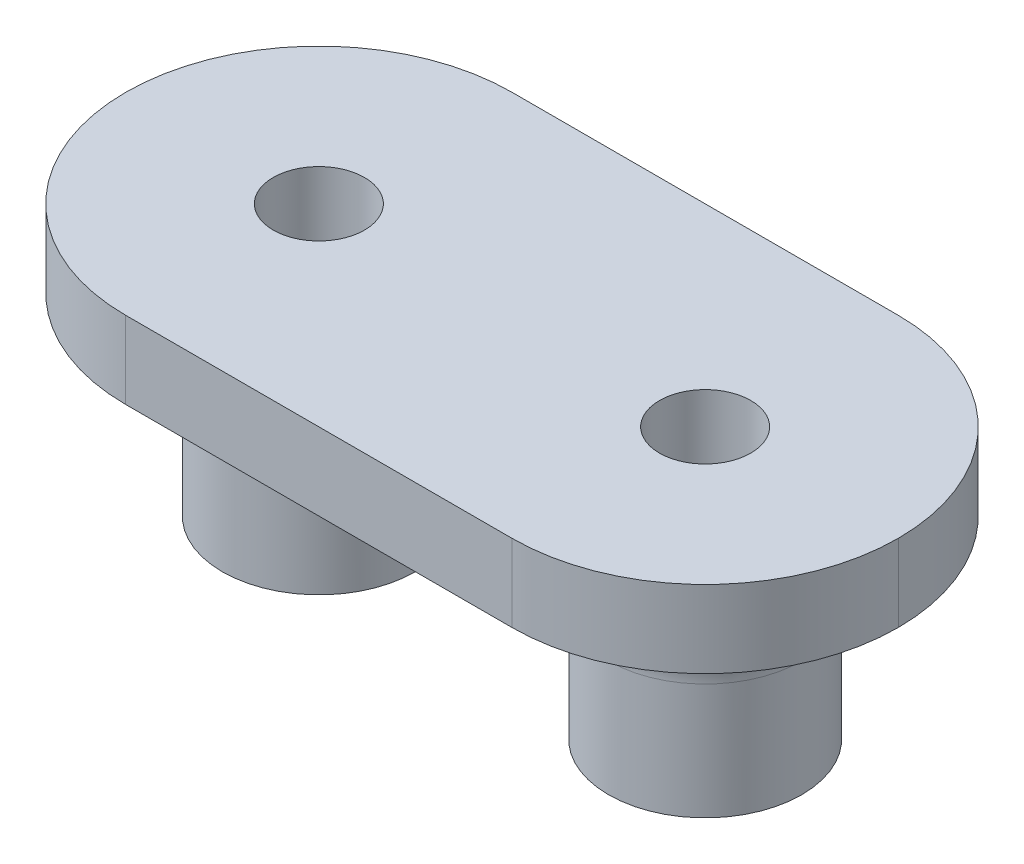
ISO-10303-21;
HEADER;
FILE_DESCRIPTION(('STEP AP214'),'2;1');
FILE_NAME('part.step','',(''),(''),'','','');
FILE_SCHEMA(('AUTOMOTIVE_DESIGN { 1 0 10303 214 1 1 1 1 }'));
ENDSEC;
DATA;
#1=APPLICATION_CONTEXT('core data for automotive mechanical design processes');
#2=APPLICATION_PROTOCOL_DEFINITION('international standard','automotive_design',2000,#1);
#3=PRODUCT_CONTEXT('',#1,'mechanical');
#4=PRODUCT('Part','Part','',(#3));
#5=PRODUCT_RELATED_PRODUCT_CATEGORY('part','',(#4));
#6=PRODUCT_DEFINITION_FORMATION('','',#4);
#7=PRODUCT_DEFINITION_CONTEXT('part definition',#1,'design');
#8=PRODUCT_DEFINITION('design','',#6,#7);
#9=PRODUCT_DEFINITION_SHAPE('','',#8);
#10=(LENGTH_UNIT() NAMED_UNIT(*) SI_UNIT(.MILLI.,.METRE.));
#11=(NAMED_UNIT(*) PLANE_ANGLE_UNIT() SI_UNIT($,.RADIAN.));
#12=(NAMED_UNIT(*) SI_UNIT($,.STERADIAN.) SOLID_ANGLE_UNIT());
#13=UNCERTAINTY_MEASURE_WITH_UNIT(LENGTH_MEASURE(1.E-05),#10,'distance_accuracy_value','');
#14=(GEOMETRIC_REPRESENTATION_CONTEXT(3) GLOBAL_UNCERTAINTY_ASSIGNED_CONTEXT((#13)) GLOBAL_UNIT_ASSIGNED_CONTEXT((#10,
#11,#12)) REPRESENTATION_CONTEXT('',''));
#15=CARTESIAN_POINT('',(0.,0.,0.));
#16=DIRECTION('',(0.,0.,1.));
#17=DIRECTION('',(1.,0.,0.));
#18=AXIS2_PLACEMENT_3D('',#15,#16,#17);
#19=CARTESIAN_POINT('',(0.,0.,0.));
#20=DIRECTION('',(0.,1.,0.));
#21=DIRECTION('',(0.,0.,1.));
#22=AXIS2_PLACEMENT_3D('',#19,#20,#21);
#23=PLANE('',#22);
#24=CARTESIAN_POINT('',(6.35,0.,6.35));
#25=DIRECTION('',(0.,1.,0.));
#26=DIRECTION('',(0.,0.,1.));
#27=AXIS2_PLACEMENT_3D('',#24,#25,#26);
#28=CIRCLE('',#27,5.715);
#29=CARTESIAN_POINT('',(6.35,0.,12.065));
#30=VERTEX_POINT('',#29);
#31=EDGE_CURVE('E41',#30,#30,#28,.T.);
#32=ORIENTED_EDGE('',*,*,#31,.T.);
#33=EDGE_LOOP('',(#32));
#34=FACE_BOUND('',#33,.T.);
#35=CARTESIAN_POINT('',(-6.35,0.,6.35));
#36=DIRECTION('',(0.,1.,0.));
#37=DIRECTION('',(0.,0.,1.));
#38=AXIS2_PLACEMENT_3D('',#35,#36,#37);
#39=CIRCLE('',#38,5.715);
#40=CARTESIAN_POINT('',(-6.35,0.,12.065));
#41=VERTEX_POINT('',#40);
#42=EDGE_CURVE('E152',#41,#41,#39,.T.);
#43=ORIENTED_EDGE('',*,*,#42,.T.);
#44=EDGE_LOOP('',(#43));
#45=FACE_BOUND('',#44,.T.);
#46=CARTESIAN_POINT('',(-6.35,0.,6.35));
#47=DIRECTION('',(0.,1.,0.));
#48=DIRECTION('',(0.,0.,1.));
#49=AXIS2_PLACEMENT_3D('',#46,#47,#48);
#50=CIRCLE('',#49,6.35);
#51=CARTESIAN_POINT('',(-6.35,0.,12.7));
#52=VERTEX_POINT('',#51);
#53=CARTESIAN_POINT('',(-12.7,0.,6.35));
#54=VERTEX_POINT('',#53);
#55=EDGE_CURVE('E97',#52,#54,#50,.F.);
#56=ORIENTED_EDGE('',*,*,#55,.T.);
#57=CARTESIAN_POINT('',(-6.35,0.,6.35));
#58=DIRECTION('',(0.,1.,0.));
#59=DIRECTION('',(0.,0.,1.));
#60=AXIS2_PLACEMENT_3D('',#57,#58,#59);
#61=CIRCLE('',#60,6.35);
#62=CARTESIAN_POINT('',(-6.35,0.,0.));
#63=VERTEX_POINT('',#62);
#64=EDGE_CURVE('E112',#54,#63,#61,.F.);
#65=ORIENTED_EDGE('',*,*,#64,.T.);
#66=DIRECTION('',(-1.,0.,0.));
#67=VECTOR('',#66,1.);
#68=CARTESIAN_POINT('',(-12.7,0.,0.));
#69=LINE('',#68,#67);
#70=CARTESIAN_POINT('',(6.35,0.,0.));
#71=VERTEX_POINT('',#70);
#72=EDGE_CURVE('E105',#71,#63,#69,.T.);
#73=ORIENTED_EDGE('',*,*,#72,.F.);
#74=CARTESIAN_POINT('',(6.35,0.,6.35));
#75=DIRECTION('',(0.,1.,0.));
#76=DIRECTION('',(0.,0.,1.));
#77=AXIS2_PLACEMENT_3D('',#74,#75,#76);
#78=CIRCLE('',#77,6.35);
#79=CARTESIAN_POINT('',(12.7,0.,6.35));
#80=VERTEX_POINT('',#79);
#81=EDGE_CURVE('E88',#71,#80,#78,.F.);
#82=ORIENTED_EDGE('',*,*,#81,.T.);
#83=CARTESIAN_POINT('',(6.35,0.,6.35));
#84=DIRECTION('',(0.,1.,0.));
#85=DIRECTION('',(0.,0.,1.));
#86=AXIS2_PLACEMENT_3D('',#83,#84,#85);
#87=CIRCLE('',#86,6.35);
#88=CARTESIAN_POINT('',(6.35,0.,12.7));
#89=VERTEX_POINT('',#88);
#90=EDGE_CURVE('E98',#80,#89,#87,.F.);
#91=ORIENTED_EDGE('',*,*,#90,.T.);
#92=DIRECTION('',(1.,0.,0.));
#93=VECTOR('',#92,1.);
#94=CARTESIAN_POINT('',(-12.7,0.,12.7));
#95=LINE('',#94,#93);
#96=EDGE_CURVE('E126',#52,#89,#95,.T.);
#97=ORIENTED_EDGE('',*,*,#96,.F.);
#98=EDGE_LOOP('',(#56,#65,#73,#82,#91,#97));
#99=FACE_BOUND('',#98,.T.);
#100=ADVANCED_FACE('F33',(#34,#45,#99),#23,.F.);
#101=CARTESIAN_POINT('',(0.,2.54,0.));
#102=DIRECTION('',(0.,1.,0.));
#103=DIRECTION('',(0.,0.,1.));
#104=AXIS2_PLACEMENT_3D('',#101,#102,#103);
#105=PLANE('',#104);
#106=DIRECTION('',(-1.,0.,0.));
#107=VECTOR('',#106,1.);
#108=CARTESIAN_POINT('',(-12.7,2.54,0.));
#109=LINE('',#108,#107);
#110=CARTESIAN_POINT('',(6.35,2.54,0.));
#111=VERTEX_POINT('',#110);
#112=CARTESIAN_POINT('',(-6.35,2.54,0.));
#113=VERTEX_POINT('',#112);
#114=EDGE_CURVE('E108',#111,#113,#109,.T.);
#115=ORIENTED_EDGE('',*,*,#114,.T.);
#116=CARTESIAN_POINT('',(-6.35,2.54,6.35));
#117=DIRECTION('',(0.,1.,0.));
#118=DIRECTION('',(0.,0.,1.));
#119=AXIS2_PLACEMENT_3D('',#116,#117,#118);
#120=CIRCLE('',#119,6.35);
#121=CARTESIAN_POINT('',(-12.7,2.54,6.35));
#122=VERTEX_POINT('',#121);
#123=EDGE_CURVE('E139',#113,#122,#120,.T.);
#124=ORIENTED_EDGE('',*,*,#123,.T.);
#125=CARTESIAN_POINT('',(-6.35,2.54,6.35));
#126=DIRECTION('',(0.,1.,0.));
#127=DIRECTION('',(0.,0.,1.));
#128=AXIS2_PLACEMENT_3D('',#125,#126,#127);
#129=CIRCLE('',#128,6.35);
#130=CARTESIAN_POINT('',(-6.35,2.54,12.7));
#131=VERTEX_POINT('',#130);
#132=EDGE_CURVE('E137',#122,#131,#129,.T.);
#133=ORIENTED_EDGE('',*,*,#132,.T.);
#134=DIRECTION('',(1.,0.,0.));
#135=VECTOR('',#134,1.);
#136=CARTESIAN_POINT('',(-12.7,2.54,12.7));
#137=LINE('',#136,#135);
#138=CARTESIAN_POINT('',(6.35,2.54,12.7));
#139=VERTEX_POINT('',#138);
#140=EDGE_CURVE('E127',#131,#139,#137,.T.);
#141=ORIENTED_EDGE('',*,*,#140,.T.);
#142=CARTESIAN_POINT('',(6.35,2.54,6.35));
#143=DIRECTION('',(0.,1.,0.));
#144=DIRECTION('',(0.,0.,1.));
#145=AXIS2_PLACEMENT_3D('',#142,#143,#144);
#146=CIRCLE('',#145,6.35);
#147=CARTESIAN_POINT('',(12.7,2.54,6.35));
#148=VERTEX_POINT('',#147);
#149=EDGE_CURVE('E48',#139,#148,#146,.T.);
#150=ORIENTED_EDGE('',*,*,#149,.T.);
#151=CARTESIAN_POINT('',(6.35,2.54,6.35));
#152=DIRECTION('',(0.,1.,0.));
#153=DIRECTION('',(0.,0.,1.));
#154=AXIS2_PLACEMENT_3D('',#151,#152,#153);
#155=CIRCLE('',#154,6.35);
#156=EDGE_CURVE('E135',#148,#111,#155,.T.);
#157=ORIENTED_EDGE('',*,*,#156,.T.);
#158=EDGE_LOOP('',(#115,#124,#133,#141,#150,#157));
#159=FACE_BOUND('',#158,.T.);
#160=CARTESIAN_POINT('',(6.35,2.54,6.35));
#161=DIRECTION('',(0.,1.,0.));
#162=DIRECTION('',(0.,0.,1.));
#163=AXIS2_PLACEMENT_3D('',#160,#161,#162);
#164=CIRCLE('',#163,1.5);
#165=CARTESIAN_POINT('',(6.35,2.54,7.85));
#166=VERTEX_POINT('',#165);
#167=EDGE_CURVE('E123',#166,#166,#164,.T.);
#168=ORIENTED_EDGE('',*,*,#167,.F.);
#169=EDGE_LOOP('',(#168));
#170=FACE_BOUND('',#169,.T.);
#171=CARTESIAN_POINT('',(-6.35,2.54,6.35));
#172=DIRECTION('',(0.,1.,0.));
#173=DIRECTION('',(0.,0.,1.));
#174=AXIS2_PLACEMENT_3D('',#171,#172,#173);
#175=CIRCLE('',#174,1.5);
#176=CARTESIAN_POINT('',(-6.35,2.54,7.85));
#177=VERTEX_POINT('',#176);
#178=EDGE_CURVE('E115',#177,#177,#175,.T.);
#179=ORIENTED_EDGE('',*,*,#178,.F.);
#180=EDGE_LOOP('',(#179));
#181=FACE_BOUND('',#180,.T.);
#182=ADVANCED_FACE('F194',(#159,#170,#181),#105,.T.);
#183=CARTESIAN_POINT('',(-12.7,2.54,12.7));
#184=DIRECTION('',(0.,0.,-1.));
#185=DIRECTION('',(-1.,0.,0.));
#186=AXIS2_PLACEMENT_3D('',#183,#184,#185);
#187=PLANE('',#186);
#188=ORIENTED_EDGE('',*,*,#140,.F.);
#189=DIRECTION('',(0.,-1.,0.));
#190=VECTOR('',#189,1.);
#191=CARTESIAN_POINT('',(-6.35,2.54,12.7));
#192=LINE('',#191,#190);
#193=EDGE_CURVE('E142',#131,#52,#192,.T.);
#194=ORIENTED_EDGE('',*,*,#193,.T.);
#195=ORIENTED_EDGE('',*,*,#96,.T.);
#196=DIRECTION('',(0.,-1.,0.));
#197=VECTOR('',#196,1.);
#198=CARTESIAN_POINT('',(6.35,2.54,12.7));
#199=LINE('',#198,#197);
#200=EDGE_CURVE('E56',#89,#139,#199,.F.);
#201=ORIENTED_EDGE('',*,*,#200,.T.);
#202=EDGE_LOOP('',(#188,#194,#195,#201));
#203=FACE_BOUND('',#202,.T.);
#204=ADVANCED_FACE('F199',(#203),#187,.F.);
#205=CARTESIAN_POINT('',(6.35,2.54,6.35));
#206=DIRECTION('',(0.,-1.,0.));
#207=DIRECTION('',(0.,0.,-1.));
#208=AXIS2_PLACEMENT_3D('',#205,#206,#207);
#209=CYLINDRICAL_SURFACE('',#208,1.5);
#210=ORIENTED_EDGE('',*,*,#167,.T.);
#211=EDGE_LOOP('',(#210));
#212=FACE_BOUND('',#211,.T.);
#213=CARTESIAN_POINT('',(6.35,-6.35,6.35));
#214=DIRECTION('',(0.,-1.,0.));
#215=DIRECTION('',(0.,0.,-1.));
#216=AXIS2_PLACEMENT_3D('',#213,#214,#215);
#217=CIRCLE('',#216,1.5);
#218=CARTESIAN_POINT('',(6.35,-6.35,4.85));
#219=VERTEX_POINT('',#218);
#220=EDGE_CURVE('E146',#219,#219,#217,.T.);
#221=ORIENTED_EDGE('',*,*,#220,.T.);
#222=EDGE_LOOP('',(#221));
#223=FACE_BOUND('',#222,.T.);
#224=ADVANCED_FACE('F182',(#212,#223),#209,.F.);
#225=CARTESIAN_POINT('',(-6.35,2.54,6.35));
#226=DIRECTION('',(0.,-1.,0.));
#227=DIRECTION('',(0.,0.,-1.));
#228=AXIS2_PLACEMENT_3D('',#225,#226,#227);
#229=CYLINDRICAL_SURFACE('',#228,1.5);
#230=ORIENTED_EDGE('',*,*,#178,.T.);
#231=EDGE_LOOP('',(#230));
#232=FACE_BOUND('',#231,.T.);
#233=CARTESIAN_POINT('',(-6.35,-6.35,6.35));
#234=DIRECTION('',(0.,-1.,0.));
#235=DIRECTION('',(0.,0.,-1.));
#236=AXIS2_PLACEMENT_3D('',#233,#234,#235);
#237=CIRCLE('',#236,1.5);
#238=CARTESIAN_POINT('',(-6.35,-6.35,4.85));
#239=VERTEX_POINT('',#238);
#240=EDGE_CURVE('E118',#239,#239,#237,.T.);
#241=ORIENTED_EDGE('',*,*,#240,.T.);
#242=EDGE_LOOP('',(#241));
#243=FACE_BOUND('',#242,.T.);
#244=ADVANCED_FACE('F228',(#232,#243),#229,.F.);
#245=CARTESIAN_POINT('',(-12.7,2.54,0.));
#246=DIRECTION('',(0.,0.,1.));
#247=DIRECTION('',(1.,0.,0.));
#248=AXIS2_PLACEMENT_3D('',#245,#246,#247);
#249=PLANE('',#248);
#250=ORIENTED_EDGE('',*,*,#114,.F.);
#251=DIRECTION('',(0.,-1.,0.));
#252=VECTOR('',#251,1.);
#253=CARTESIAN_POINT('',(6.35,2.54,0.));
#254=LINE('',#253,#252);
#255=EDGE_CURVE('E92',#111,#71,#254,.T.);
#256=ORIENTED_EDGE('',*,*,#255,.T.);
#257=ORIENTED_EDGE('',*,*,#72,.T.);
#258=DIRECTION('',(0.,-1.,0.));
#259=VECTOR('',#258,1.);
#260=CARTESIAN_POINT('',(-6.35,2.54,0.));
#261=LINE('',#260,#259);
#262=EDGE_CURVE('E109',#63,#113,#261,.F.);
#263=ORIENTED_EDGE('',*,*,#262,.T.);
#264=EDGE_LOOP('',(#250,#256,#257,#263));
#265=FACE_BOUND('',#264,.T.);
#266=ADVANCED_FACE('F103',(#265),#249,.F.);
#267=CARTESIAN_POINT('',(-6.35,-6.35,6.35));
#268=DIRECTION('',(0.,-1.,0.));
#269=DIRECTION('',(0.,0.,-1.));
#270=AXIS2_PLACEMENT_3D('',#267,#268,#269);
#271=PLANE('',#270);
#272=CARTESIAN_POINT('',(-6.35,-6.35,6.35));
#273=DIRECTION('',(0.,-1.,0.));
#274=DIRECTION('',(0.,0.,-1.));
#275=AXIS2_PLACEMENT_3D('',#272,#273,#274);
#276=CIRCLE('',#275,3.175);
#277=CARTESIAN_POINT('',(-6.35,-6.35,3.175));
#278=VERTEX_POINT('',#277);
#279=EDGE_CURVE('E113',#278,#278,#276,.T.);
#280=ORIENTED_EDGE('',*,*,#279,.T.);
#281=EDGE_LOOP('',(#280));
#282=FACE_BOUND('',#281,.T.);
#283=ORIENTED_EDGE('',*,*,#240,.F.);
#284=EDGE_LOOP('',(#283));
#285=FACE_BOUND('',#284,.T.);
#286=ADVANCED_FACE('F190',(#282,#285),#271,.T.);
#287=CARTESIAN_POINT('',(-6.35,-6.35,6.35));
#288=DIRECTION('',(0.,1.,0.));
#289=DIRECTION('',(0.,0.,1.));
#290=AXIS2_PLACEMENT_3D('',#287,#288,#289);
#291=CYLINDRICAL_SURFACE('',#290,3.175);
#292=CARTESIAN_POINT('',(-6.35,-2.54,6.35));
#293=DIRECTION('',(0.,1.,0.));
#294=DIRECTION('',(0.,0.,1.));
#295=AXIS2_PLACEMENT_3D('',#292,#293,#294);
#296=CIRCLE('',#295,3.175);
#297=CARTESIAN_POINT('',(-6.35,-2.54,9.525));
#298=VERTEX_POINT('',#297);
#299=EDGE_CURVE('E11',#298,#298,#296,.F.);
#300=ORIENTED_EDGE('',*,*,#299,.T.);
#301=EDGE_LOOP('',(#300));
#302=FACE_BOUND('',#301,.T.);
#303=ORIENTED_EDGE('',*,*,#279,.F.);
#304=EDGE_LOOP('',(#303));
#305=FACE_BOUND('',#304,.T.);
#306=ADVANCED_FACE('F185',(#302,#305),#291,.T.);
#307=CARTESIAN_POINT('',(6.35,-6.35,6.35));
#308=DIRECTION('',(0.,-1.,0.));
#309=DIRECTION('',(0.,0.,-1.));
#310=AXIS2_PLACEMENT_3D('',#307,#308,#309);
#311=PLANE('',#310);
#312=CARTESIAN_POINT('',(6.35,-6.35,6.35));
#313=DIRECTION('',(0.,-1.,0.));
#314=DIRECTION('',(0.,0.,-1.));
#315=AXIS2_PLACEMENT_3D('',#312,#313,#314);
#316=CIRCLE('',#315,3.175);
#317=CARTESIAN_POINT('',(6.35,-6.35,3.175));
#318=VERTEX_POINT('',#317);
#319=EDGE_CURVE('E173',#318,#318,#316,.T.);
#320=ORIENTED_EDGE('',*,*,#319,.T.);
#321=EDGE_LOOP('',(#320));
#322=FACE_BOUND('',#321,.T.);
#323=ORIENTED_EDGE('',*,*,#220,.F.);
#324=EDGE_LOOP('',(#323));
#325=FACE_BOUND('',#324,.T.);
#326=ADVANCED_FACE('F169',(#322,#325),#311,.T.);
#327=CARTESIAN_POINT('',(6.35,-6.35,6.35));
#328=DIRECTION('',(0.,1.,0.));
#329=DIRECTION('',(0.,0.,1.));
#330=AXIS2_PLACEMENT_3D('',#327,#328,#329);
#331=CYLINDRICAL_SURFACE('',#330,3.175);
#332=CARTESIAN_POINT('',(6.35,-2.54,6.35));
#333=DIRECTION('',(0.,1.,0.));
#334=DIRECTION('',(0.,0.,1.));
#335=AXIS2_PLACEMENT_3D('',#332,#333,#334);
#336=CIRCLE('',#335,3.175);
#337=CARTESIAN_POINT('',(6.35,-2.54,9.525));
#338=VERTEX_POINT('',#337);
#339=EDGE_CURVE('E144',#338,#338,#336,.F.);
#340=ORIENTED_EDGE('',*,*,#339,.T.);
#341=EDGE_LOOP('',(#340));
#342=FACE_BOUND('',#341,.T.);
#343=ORIENTED_EDGE('',*,*,#319,.F.);
#344=EDGE_LOOP('',(#343));
#345=FACE_BOUND('',#344,.T.);
#346=ADVANCED_FACE('F165',(#342,#345),#331,.T.);
#347=CARTESIAN_POINT('',(6.35,2.54,6.35));
#348=DIRECTION('',(0.,-1.,0.));
#349=DIRECTION('',(0.,0.,-1.));
#350=AXIS2_PLACEMENT_3D('',#347,#348,#349);
#351=CYLINDRICAL_SURFACE('',#350,6.35);
#352=DIRECTION('',(0.,-1.,0.));
#353=VECTOR('',#352,1.);
#354=CARTESIAN_POINT('',(12.7,2.54,6.35));
#355=LINE('',#354,#353);
#356=EDGE_CURVE('E93',#148,#80,#355,.T.);
#357=ORIENTED_EDGE('',*,*,#356,.F.);
#358=ORIENTED_EDGE('',*,*,#149,.F.);
#359=ORIENTED_EDGE('',*,*,#200,.F.);
#360=ORIENTED_EDGE('',*,*,#90,.F.);
#361=EDGE_LOOP('',(#357,#358,#359,#360));
#362=FACE_BOUND('',#361,.T.);
#363=ADVANCED_FACE('F168',(#362),#351,.T.);
#364=CARTESIAN_POINT('',(6.35,2.54,6.35));
#365=DIRECTION('',(0.,-1.,0.));
#366=DIRECTION('',(0.,0.,-1.));
#367=AXIS2_PLACEMENT_3D('',#364,#365,#366);
#368=CYLINDRICAL_SURFACE('',#367,6.35);
#369=ORIENTED_EDGE('',*,*,#156,.F.);
#370=ORIENTED_EDGE('',*,*,#356,.T.);
#371=ORIENTED_EDGE('',*,*,#81,.F.);
#372=ORIENTED_EDGE('',*,*,#255,.F.);
#373=EDGE_LOOP('',(#369,#370,#371,#372));
#374=FACE_BOUND('',#373,.T.);
#375=ADVANCED_FACE('F91',(#374),#368,.T.);
#376=CARTESIAN_POINT('',(-6.35,2.54,6.35));
#377=DIRECTION('',(0.,-1.,0.));
#378=DIRECTION('',(0.,0.,-1.));
#379=AXIS2_PLACEMENT_3D('',#376,#377,#378);
#380=CYLINDRICAL_SURFACE('',#379,6.35);
#381=ORIENTED_EDGE('',*,*,#193,.F.);
#382=ORIENTED_EDGE('',*,*,#132,.F.);
#383=DIRECTION('',(0.,-1.,0.));
#384=VECTOR('',#383,1.);
#385=CARTESIAN_POINT('',(-12.7,2.54,6.35));
#386=LINE('',#385,#384);
#387=EDGE_CURVE('E147',#54,#122,#386,.F.);
#388=ORIENTED_EDGE('',*,*,#387,.F.);
#389=ORIENTED_EDGE('',*,*,#55,.F.);
#390=EDGE_LOOP('',(#381,#382,#388,#389));
#391=FACE_BOUND('',#390,.T.);
#392=ADVANCED_FACE('F207',(#391),#380,.T.);
#393=CARTESIAN_POINT('',(-6.35,2.54,6.35));
#394=DIRECTION('',(0.,-1.,0.));
#395=DIRECTION('',(0.,0.,-1.));
#396=AXIS2_PLACEMENT_3D('',#393,#394,#395);
#397=CYLINDRICAL_SURFACE('',#396,6.35);
#398=ORIENTED_EDGE('',*,*,#123,.F.);
#399=ORIENTED_EDGE('',*,*,#262,.F.);
#400=ORIENTED_EDGE('',*,*,#64,.F.);
#401=ORIENTED_EDGE('',*,*,#387,.T.);
#402=EDGE_LOOP('',(#398,#399,#400,#401));
#403=FACE_BOUND('',#402,.T.);
#404=ADVANCED_FACE('F162',(#403),#397,.T.);
#405=CARTESIAN_POINT('',(6.35,-2.54,6.35));
#406=DIRECTION('',(0.,1.,0.));
#407=DIRECTION('',(0.,0.,1.));
#408=AXIS2_PLACEMENT_3D('',#405,#406,#407);
#409=TOROIDAL_SURFACE('',#408,5.715,2.54);
#410=ORIENTED_EDGE('',*,*,#31,.F.);
#411=EDGE_LOOP('',(#410));
#412=FACE_BOUND('',#411,.T.);
#413=ORIENTED_EDGE('',*,*,#339,.F.);
#414=EDGE_LOOP('',(#413));
#415=FACE_BOUND('',#414,.T.);
#416=ADVANCED_FACE('F159',(#412,#415),#409,.F.);
#417=CARTESIAN_POINT('',(-6.35,-2.54,6.35));
#418=DIRECTION('',(0.,1.,0.));
#419=DIRECTION('',(0.,0.,1.));
#420=AXIS2_PLACEMENT_3D('',#417,#418,#419);
#421=TOROIDAL_SURFACE('',#420,5.715,2.54);
#422=ORIENTED_EDGE('',*,*,#42,.F.);
#423=EDGE_LOOP('',(#422));
#424=FACE_BOUND('',#423,.T.);
#425=ORIENTED_EDGE('',*,*,#299,.F.);
#426=EDGE_LOOP('',(#425));
#427=FACE_BOUND('',#426,.T.);
#428=ADVANCED_FACE('F35',(#424,#427),#421,.F.);
#429=CLOSED_SHELL('',(#100,#182,#204,#224,#244,#266,#286,#306,#326,#346,#363,#375,#392,#404,
#416,#428));
#430=MANIFOLD_SOLID_BREP('B2',#429);
#431=ADVANCED_BREP_SHAPE_REPRESENTATION('',(#18,#430),#14);
#432=SHAPE_DEFINITION_REPRESENTATION(#9,#431);
ENDSEC;
END-ISO-10303-21;
